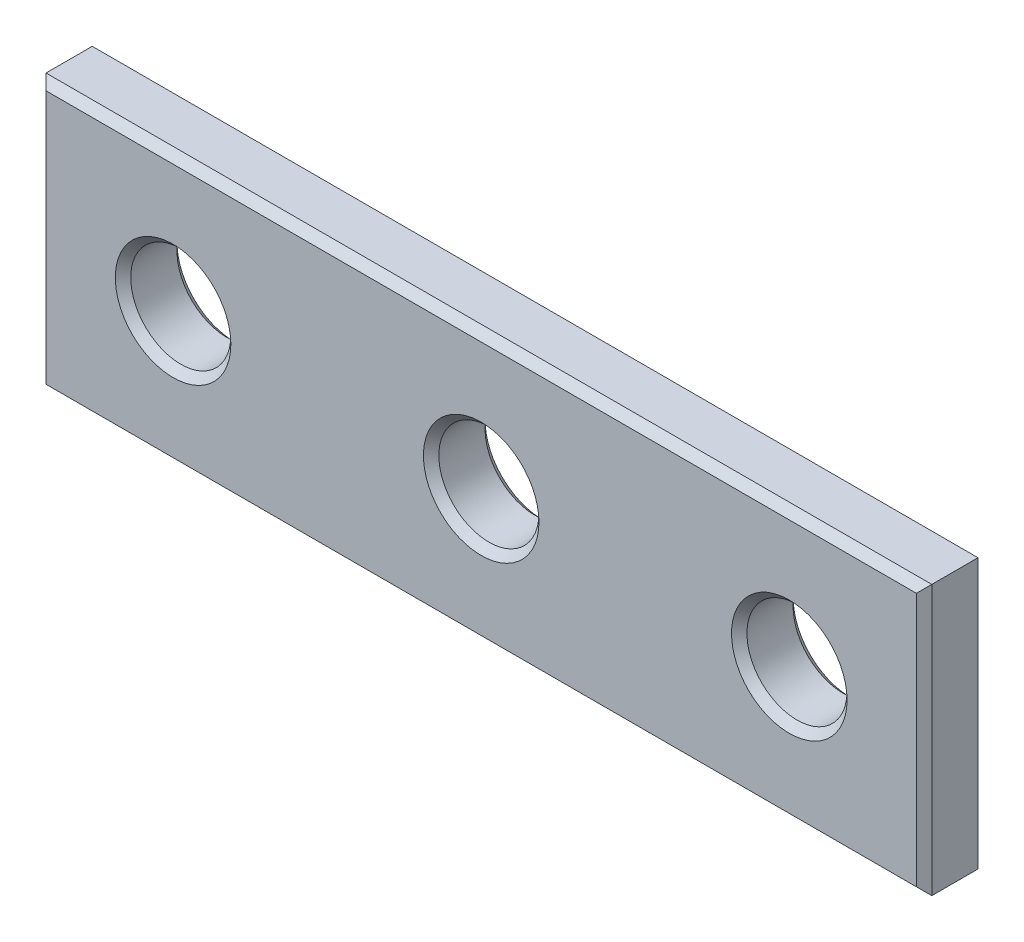
ISO-10303-21;
HEADER;
FILE_DESCRIPTION(('STEP AP214'),'2;1');
FILE_NAME('part.step','',(''),(''),'','','');
FILE_SCHEMA(('AUTOMOTIVE_DESIGN { 1 0 10303 214 1 1 1 1 }'));
ENDSEC;
DATA;
#1=APPLICATION_CONTEXT('core data for automotive mechanical design processes');
#2=APPLICATION_PROTOCOL_DEFINITION('international standard','automotive_design',2000,#1);
#3=PRODUCT_CONTEXT('',#1,'mechanical');
#4=PRODUCT('Part','Part','',(#3));
#5=PRODUCT_RELATED_PRODUCT_CATEGORY('part','',(#4));
#6=PRODUCT_DEFINITION_FORMATION('','',#4);
#7=PRODUCT_DEFINITION_CONTEXT('part definition',#1,'design');
#8=PRODUCT_DEFINITION('design','',#6,#7);
#9=PRODUCT_DEFINITION_SHAPE('','',#8);
#10=(LENGTH_UNIT() NAMED_UNIT(*) SI_UNIT(.MILLI.,.METRE.));
#11=(NAMED_UNIT(*) PLANE_ANGLE_UNIT() SI_UNIT($,.RADIAN.));
#12=(NAMED_UNIT(*) SI_UNIT($,.STERADIAN.) SOLID_ANGLE_UNIT());
#13=UNCERTAINTY_MEASURE_WITH_UNIT(LENGTH_MEASURE(1.E-05),#10,'distance_accuracy_value','');
#14=(GEOMETRIC_REPRESENTATION_CONTEXT(3) GLOBAL_UNCERTAINTY_ASSIGNED_CONTEXT((#13)) GLOBAL_UNIT_ASSIGNED_CONTEXT((#10,
#11,#12)) REPRESENTATION_CONTEXT('',''));
#15=CARTESIAN_POINT('',(0.,0.,0.));
#16=DIRECTION('',(0.,0.,1.));
#17=DIRECTION('',(1.,0.,0.));
#18=AXIS2_PLACEMENT_3D('',#15,#16,#17);
#19=CARTESIAN_POINT('',(-115.,35.,16.));
#20=DIRECTION('',(0.,0.,1.));
#21=DIRECTION('',(1.,0.,0.));
#22=AXIS2_PLACEMENT_3D('',#19,#20,#21);
#23=PLANE('',#22);
#24=CARTESIAN_POINT('',(-80.,0.,16.));
#25=DIRECTION('',(0.,0.,1.));
#26=DIRECTION('',(1.,0.,0.));
#27=AXIS2_PLACEMENT_3D('',#24,#25,#26);
#28=CIRCLE('',#27,15.);
#29=CARTESIAN_POINT('',(-65.,0.,16.));
#30=VERTEX_POINT('',#29);
#31=EDGE_CURVE('E11',#30,#30,#28,.F.);
#32=ORIENTED_EDGE('',*,*,#31,.T.);
#33=EDGE_LOOP('',(#32));
#34=FACE_BOUND('',#33,.T.);
#35=CARTESIAN_POINT('',(0.,0.,16.));
#36=DIRECTION('',(0.,0.,1.));
#37=DIRECTION('',(1.,0.,0.));
#38=AXIS2_PLACEMENT_3D('',#35,#36,#37);
#39=CIRCLE('',#38,15.);
#40=CARTESIAN_POINT('',(15.,0.,16.));
#41=VERTEX_POINT('',#40);
#42=EDGE_CURVE('E43',#41,#41,#39,.F.);
#43=ORIENTED_EDGE('',*,*,#42,.T.);
#44=EDGE_LOOP('',(#43));
#45=FACE_BOUND('',#44,.T.);
#46=DIRECTION('',(0.,1.,0.));
#47=VECTOR('',#46,1.);
#48=CARTESIAN_POINT('',(113.,35.,16.));
#49=LINE('',#48,#47);
#50=CARTESIAN_POINT('',(113.,-33.,16.));
#51=VERTEX_POINT('',#50);
#52=CARTESIAN_POINT('',(113.,33.,16.));
#53=VERTEX_POINT('',#52);
#54=EDGE_CURVE('E51',#51,#53,#49,.T.);
#55=ORIENTED_EDGE('',*,*,#54,.T.);
#56=DIRECTION('',(-1.,0.,0.));
#57=VECTOR('',#56,1.);
#58=CARTESIAN_POINT('',(-115.,33.,16.));
#59=LINE('',#58,#57);
#60=CARTESIAN_POINT('',(-113.,33.,16.));
#61=VERTEX_POINT('',#60);
#62=EDGE_CURVE('E180',#53,#61,#59,.T.);
#63=ORIENTED_EDGE('',*,*,#62,.T.);
#64=DIRECTION('',(0.,-1.,0.));
#65=VECTOR('',#64,1.);
#66=CARTESIAN_POINT('',(-113.,-35.,16.));
#67=LINE('',#66,#65);
#68=CARTESIAN_POINT('',(-113.,-33.,16.));
#69=VERTEX_POINT('',#68);
#70=EDGE_CURVE('E176',#61,#69,#67,.T.);
#71=ORIENTED_EDGE('',*,*,#70,.T.);
#72=DIRECTION('',(1.,0.,0.));
#73=VECTOR('',#72,1.);
#74=CARTESIAN_POINT('',(115.,-33.,16.));
#75=LINE('',#74,#73);
#76=EDGE_CURVE('E56',#69,#51,#75,.T.);
#77=ORIENTED_EDGE('',*,*,#76,.T.);
#78=EDGE_LOOP('',(#55,#63,#71,#77));
#79=FACE_BOUND('',#78,.T.);
#80=CARTESIAN_POINT('',(80.,0.,16.));
#81=DIRECTION('',(0.,0.,1.));
#82=DIRECTION('',(1.,0.,0.));
#83=AXIS2_PLACEMENT_3D('',#80,#81,#82);
#84=CIRCLE('',#83,15.);
#85=CARTESIAN_POINT('',(95.,0.,16.));
#86=VERTEX_POINT('',#85);
#87=EDGE_CURVE('E173',#86,#86,#84,.F.);
#88=ORIENTED_EDGE('',*,*,#87,.T.);
#89=EDGE_LOOP('',(#88));
#90=FACE_BOUND('',#89,.T.);
#91=ADVANCED_FACE('F34',(#34,#45,#79,#90),#23,.T.);
#92=CARTESIAN_POINT('',(-115.,35.,0.));
#93=DIRECTION('',(0.,0.,1.));
#94=DIRECTION('',(1.,0.,0.));
#95=AXIS2_PLACEMENT_3D('',#92,#93,#94);
#96=PLANE('',#95);
#97=CARTESIAN_POINT('',(-80.,0.,0.));
#98=DIRECTION('',(0.,0.,1.));
#99=DIRECTION('',(1.,0.,0.));
#100=AXIS2_PLACEMENT_3D('',#97,#98,#99);
#101=CIRCLE('',#100,15.);
#102=CARTESIAN_POINT('',(-65.,0.,0.));
#103=VERTEX_POINT('',#102);
#104=EDGE_CURVE('E132',#103,#103,#101,.T.);
#105=ORIENTED_EDGE('',*,*,#104,.T.);
#106=EDGE_LOOP('',(#105));
#107=FACE_BOUND('',#106,.T.);
#108=CARTESIAN_POINT('',(0.,0.,0.));
#109=DIRECTION('',(0.,0.,1.));
#110=DIRECTION('',(1.,0.,0.));
#111=AXIS2_PLACEMENT_3D('',#108,#109,#110);
#112=CIRCLE('',#111,15.);
#113=CARTESIAN_POINT('',(15.,0.,0.));
#114=VERTEX_POINT('',#113);
#115=EDGE_CURVE('E129',#114,#114,#112,.T.);
#116=ORIENTED_EDGE('',*,*,#115,.T.);
#117=EDGE_LOOP('',(#116));
#118=FACE_BOUND('',#117,.T.);
#119=DIRECTION('',(0.,-1.,0.));
#120=VECTOR('',#119,1.);
#121=CARTESIAN_POINT('',(113.,35.,0.));
#122=LINE('',#121,#120);
#123=CARTESIAN_POINT('',(113.,33.,0.));
#124=VERTEX_POINT('',#123);
#125=CARTESIAN_POINT('',(113.,-33.,0.));
#126=VERTEX_POINT('',#125);
#127=EDGE_CURVE('E128',#124,#126,#122,.T.);
#128=ORIENTED_EDGE('',*,*,#127,.T.);
#129=DIRECTION('',(-1.,0.,0.));
#130=VECTOR('',#129,1.);
#131=CARTESIAN_POINT('',(-115.,-33.,0.));
#132=LINE('',#131,#130);
#133=CARTESIAN_POINT('',(-113.,-33.,0.));
#134=VERTEX_POINT('',#133);
#135=EDGE_CURVE('E106',#126,#134,#132,.T.);
#136=ORIENTED_EDGE('',*,*,#135,.T.);
#137=DIRECTION('',(0.,1.,0.));
#138=VECTOR('',#137,1.);
#139=CARTESIAN_POINT('',(-113.,35.,0.));
#140=LINE('',#139,#138);
#141=CARTESIAN_POINT('',(-113.,33.,0.));
#142=VERTEX_POINT('',#141);
#143=EDGE_CURVE('E116',#134,#142,#140,.T.);
#144=ORIENTED_EDGE('',*,*,#143,.T.);
#145=DIRECTION('',(1.,0.,0.));
#146=VECTOR('',#145,1.);
#147=CARTESIAN_POINT('',(-115.,33.,0.));
#148=LINE('',#147,#146);
#149=EDGE_CURVE('E122',#142,#124,#148,.T.);
#150=ORIENTED_EDGE('',*,*,#149,.T.);
#151=EDGE_LOOP('',(#128,#136,#144,#150));
#152=FACE_BOUND('',#151,.T.);
#153=CARTESIAN_POINT('',(80.,0.,0.));
#154=DIRECTION('',(0.,0.,1.));
#155=DIRECTION('',(1.,0.,0.));
#156=AXIS2_PLACEMENT_3D('',#153,#154,#155);
#157=CIRCLE('',#156,15.);
#158=CARTESIAN_POINT('',(95.,0.,0.));
#159=VERTEX_POINT('',#158);
#160=EDGE_CURVE('E123',#159,#159,#157,.T.);
#161=ORIENTED_EDGE('',*,*,#160,.T.);
#162=EDGE_LOOP('',(#161));
#163=FACE_BOUND('',#162,.T.);
#164=ADVANCED_FACE('F125',(#107,#118,#152,#163),#96,.F.);
#165=CARTESIAN_POINT('',(-115.,35.,16.));
#166=DIRECTION('',(1.,0.,0.));
#167=DIRECTION('',(0.,1.,0.));
#168=AXIS2_PLACEMENT_3D('',#165,#166,#167);
#169=PLANE('',#168);
#170=DIRECTION('',(0.,0.,-1.));
#171=VECTOR('',#170,1.);
#172=CARTESIAN_POINT('',(-115.,35.,16.));
#173=LINE('',#172,#171);
#174=CARTESIAN_POINT('',(-115.,35.,14.));
#175=VERTEX_POINT('',#174);
#176=CARTESIAN_POINT('',(-115.,35.,1.99999999999999));
#177=VERTEX_POINT('',#176);
#178=EDGE_CURVE('E188',#175,#177,#173,.T.);
#179=ORIENTED_EDGE('',*,*,#178,.T.);
#180=DIRECTION('',(0.,-1.,0.));
#181=VECTOR('',#180,1.);
#182=CARTESIAN_POINT('',(-115.,35.,1.99999999999999));
#183=LINE('',#182,#181);
#184=CARTESIAN_POINT('',(-115.,-35.,1.99999999999999));
#185=VERTEX_POINT('',#184);
#186=EDGE_CURVE('E165',#177,#185,#183,.T.);
#187=ORIENTED_EDGE('',*,*,#186,.T.);
#188=DIRECTION('',(0.,0.,-1.));
#189=VECTOR('',#188,1.);
#190=CARTESIAN_POINT('',(-115.,-35.,16.));
#191=LINE('',#190,#189);
#192=CARTESIAN_POINT('',(-115.,-35.,14.));
#193=VERTEX_POINT('',#192);
#194=EDGE_CURVE('E210',#193,#185,#191,.T.);
#195=ORIENTED_EDGE('',*,*,#194,.F.);
#196=DIRECTION('',(0.,1.,0.));
#197=VECTOR('',#196,1.);
#198=CARTESIAN_POINT('',(-115.,35.,14.));
#199=LINE('',#198,#197);
#200=EDGE_CURVE('E163',#193,#175,#199,.T.);
#201=ORIENTED_EDGE('',*,*,#200,.T.);
#202=EDGE_LOOP('',(#179,#187,#195,#201));
#203=FACE_BOUND('',#202,.T.);
#204=ADVANCED_FACE('F215',(#203),#169,.F.);
#205=CARTESIAN_POINT('',(-115.,-35.,16.));
#206=DIRECTION('',(0.,1.,0.));
#207=DIRECTION('',(-1.,0.,0.));
#208=AXIS2_PLACEMENT_3D('',#205,#206,#207);
#209=PLANE('',#208);
#210=ORIENTED_EDGE('',*,*,#194,.T.);
#211=DIRECTION('',(1.,0.,0.));
#212=VECTOR('',#211,1.);
#213=CARTESIAN_POINT('',(-115.,-35.,1.99999999999999));
#214=LINE('',#213,#212);
#215=CARTESIAN_POINT('',(115.,-35.,1.99999999999999));
#216=VERTEX_POINT('',#215);
#217=EDGE_CURVE('E109',#185,#216,#214,.T.);
#218=ORIENTED_EDGE('',*,*,#217,.T.);
#219=DIRECTION('',(0.,0.,-1.));
#220=VECTOR('',#219,1.);
#221=CARTESIAN_POINT('',(115.,-35.,16.));
#222=LINE('',#221,#220);
#223=CARTESIAN_POINT('',(115.,-35.,14.));
#224=VERTEX_POINT('',#223);
#225=EDGE_CURVE('E212',#224,#216,#222,.T.);
#226=ORIENTED_EDGE('',*,*,#225,.F.);
#227=DIRECTION('',(-1.,0.,0.));
#228=VECTOR('',#227,1.);
#229=CARTESIAN_POINT('',(-115.,-35.,14.));
#230=LINE('',#229,#228);
#231=EDGE_CURVE('E151',#224,#193,#230,.T.);
#232=ORIENTED_EDGE('',*,*,#231,.T.);
#233=EDGE_LOOP('',(#210,#218,#226,#232));
#234=FACE_BOUND('',#233,.T.);
#235=ADVANCED_FACE('F209',(#234),#209,.F.);
#236=CARTESIAN_POINT('',(115.,35.,16.));
#237=DIRECTION('',(-1.,0.,0.));
#238=DIRECTION('',(0.,0.,1.));
#239=AXIS2_PLACEMENT_3D('',#236,#237,#238);
#240=PLANE('',#239);
#241=ORIENTED_EDGE('',*,*,#225,.T.);
#242=DIRECTION('',(0.,1.,0.));
#243=VECTOR('',#242,1.);
#244=CARTESIAN_POINT('',(115.,35.,1.99999999999999));
#245=LINE('',#244,#243);
#246=CARTESIAN_POINT('',(115.,35.,1.99999999999999));
#247=VERTEX_POINT('',#246);
#248=EDGE_CURVE('E156',#216,#247,#245,.T.);
#249=ORIENTED_EDGE('',*,*,#248,.T.);
#250=DIRECTION('',(0.,0.,-1.));
#251=VECTOR('',#250,1.);
#252=CARTESIAN_POINT('',(115.,35.,16.));
#253=LINE('',#252,#251);
#254=CARTESIAN_POINT('',(115.,35.,14.));
#255=VERTEX_POINT('',#254);
#256=EDGE_CURVE('E220',#255,#247,#253,.T.);
#257=ORIENTED_EDGE('',*,*,#256,.F.);
#258=DIRECTION('',(0.,-1.,0.));
#259=VECTOR('',#258,1.);
#260=CARTESIAN_POINT('',(115.,-35.,14.));
#261=LINE('',#260,#259);
#262=EDGE_CURVE('E154',#255,#224,#261,.T.);
#263=ORIENTED_EDGE('',*,*,#262,.T.);
#264=EDGE_LOOP('',(#241,#249,#257,#263));
#265=FACE_BOUND('',#264,.T.);
#266=ADVANCED_FACE('F233',(#265),#240,.F.);
#267=CARTESIAN_POINT('',(-115.,35.,16.));
#268=DIRECTION('',(0.,-1.,0.));
#269=DIRECTION('',(0.,0.,-1.));
#270=AXIS2_PLACEMENT_3D('',#267,#268,#269);
#271=PLANE('',#270);
#272=ORIENTED_EDGE('',*,*,#256,.T.);
#273=DIRECTION('',(-1.,0.,0.));
#274=VECTOR('',#273,1.);
#275=CARTESIAN_POINT('',(-115.,35.,1.99999999999999));
#276=LINE('',#275,#274);
#277=EDGE_CURVE('E161',#247,#177,#276,.T.);
#278=ORIENTED_EDGE('',*,*,#277,.T.);
#279=ORIENTED_EDGE('',*,*,#178,.F.);
#280=DIRECTION('',(1.,0.,0.));
#281=VECTOR('',#280,1.);
#282=CARTESIAN_POINT('',(115.,35.,14.));
#283=LINE('',#282,#281);
#284=EDGE_CURVE('E158',#175,#255,#283,.T.);
#285=ORIENTED_EDGE('',*,*,#284,.T.);
#286=EDGE_LOOP('',(#272,#278,#279,#285));
#287=FACE_BOUND('',#286,.T.);
#288=ADVANCED_FACE('F237',(#287),#271,.F.);
#289=CARTESIAN_POINT('',(0.,0.,16.));
#290=DIRECTION('',(0.,0.,-1.));
#291=DIRECTION('',(-1.,0.,0.));
#292=AXIS2_PLACEMENT_3D('',#289,#290,#291);
#293=CYLINDRICAL_SURFACE('',#292,13.);
#294=CARTESIAN_POINT('',(0.,0.,2.00000000000001));
#295=DIRECTION('',(0.,0.,1.));
#296=DIRECTION('',(1.,0.,0.));
#297=AXIS2_PLACEMENT_3D('',#294,#295,#296);
#298=CIRCLE('',#297,13.);
#299=CARTESIAN_POINT('',(13.,0.,2.00000000000001));
#300=VERTEX_POINT('',#299);
#301=EDGE_CURVE('E148',#300,#300,#298,.F.);
#302=ORIENTED_EDGE('',*,*,#301,.T.);
#303=EDGE_LOOP('',(#302));
#304=FACE_BOUND('',#303,.T.);
#305=CARTESIAN_POINT('',(0.,0.,14.));
#306=DIRECTION('',(0.,0.,1.));
#307=DIRECTION('',(1.,0.,0.));
#308=AXIS2_PLACEMENT_3D('',#305,#306,#307);
#309=CIRCLE('',#308,13.);
#310=CARTESIAN_POINT('',(13.,0.,14.));
#311=VERTEX_POINT('',#310);
#312=EDGE_CURVE('E145',#311,#311,#309,.T.);
#313=ORIENTED_EDGE('',*,*,#312,.T.);
#314=EDGE_LOOP('',(#313));
#315=FACE_BOUND('',#314,.T.);
#316=ADVANCED_FACE('F256',(#304,#315),#293,.F.);
#317=CARTESIAN_POINT('',(80.,0.,16.));
#318=DIRECTION('',(0.,0.,-1.));
#319=DIRECTION('',(-1.,0.,0.));
#320=AXIS2_PLACEMENT_3D('',#317,#318,#319);
#321=CYLINDRICAL_SURFACE('',#320,13.);
#322=CARTESIAN_POINT('',(80.,0.,2.00000000000001));
#323=DIRECTION('',(0.,0.,1.));
#324=DIRECTION('',(1.,0.,0.));
#325=AXIS2_PLACEMENT_3D('',#322,#323,#324);
#326=CIRCLE('',#325,13.);
#327=CARTESIAN_POINT('',(93.,0.,2.00000000000001));
#328=VERTEX_POINT('',#327);
#329=EDGE_CURVE('E170',#328,#328,#326,.F.);
#330=ORIENTED_EDGE('',*,*,#329,.T.);
#331=EDGE_LOOP('',(#330));
#332=FACE_BOUND('',#331,.T.);
#333=CARTESIAN_POINT('',(80.,0.,14.));
#334=DIRECTION('',(0.,0.,1.));
#335=DIRECTION('',(1.,0.,0.));
#336=AXIS2_PLACEMENT_3D('',#333,#334,#335);
#337=CIRCLE('',#336,13.);
#338=CARTESIAN_POINT('',(93.,0.,14.));
#339=VERTEX_POINT('',#338);
#340=EDGE_CURVE('E167',#339,#339,#337,.T.);
#341=ORIENTED_EDGE('',*,*,#340,.T.);
#342=EDGE_LOOP('',(#341));
#343=FACE_BOUND('',#342,.T.);
#344=ADVANCED_FACE('F253',(#332,#343),#321,.F.);
#345=CARTESIAN_POINT('',(-80.,0.,16.));
#346=DIRECTION('',(0.,0.,-1.));
#347=DIRECTION('',(-1.,0.,0.));
#348=AXIS2_PLACEMENT_3D('',#345,#346,#347);
#349=CYLINDRICAL_SURFACE('',#348,13.);
#350=CARTESIAN_POINT('',(-80.,0.,2.00000000000001));
#351=DIRECTION('',(0.,0.,1.));
#352=DIRECTION('',(1.,0.,0.));
#353=AXIS2_PLACEMENT_3D('',#350,#351,#352);
#354=CIRCLE('',#353,13.);
#355=CARTESIAN_POINT('',(-67.,0.,2.00000000000001));
#356=VERTEX_POINT('',#355);
#357=EDGE_CURVE('E142',#356,#356,#354,.F.);
#358=ORIENTED_EDGE('',*,*,#357,.T.);
#359=EDGE_LOOP('',(#358));
#360=FACE_BOUND('',#359,.T.);
#361=CARTESIAN_POINT('',(-80.,0.,14.));
#362=DIRECTION('',(0.,0.,1.));
#363=DIRECTION('',(1.,0.,0.));
#364=AXIS2_PLACEMENT_3D('',#361,#362,#363);
#365=CIRCLE('',#364,13.);
#366=CARTESIAN_POINT('',(-67.,0.,14.));
#367=VERTEX_POINT('',#366);
#368=EDGE_CURVE('E139',#367,#367,#365,.T.);
#369=ORIENTED_EDGE('',*,*,#368,.T.);
#370=EDGE_LOOP('',(#369));
#371=FACE_BOUND('',#370,.T.);
#372=ADVANCED_FACE('F255',(#360,#371),#349,.F.);
#373=CARTESIAN_POINT('',(-80.,0.,0.));
#374=DIRECTION('',(0.,0.,-1.));
#375=DIRECTION('',(-1.,0.,0.));
#376=AXIS2_PLACEMENT_3D('',#373,#374,#375);
#377=CONICAL_SURFACE('',#376,15.,0.785398163397442);
#378=ORIENTED_EDGE('',*,*,#357,.F.);
#379=EDGE_LOOP('',(#378));
#380=FACE_BOUND('',#379,.T.);
#381=ORIENTED_EDGE('',*,*,#104,.F.);
#382=EDGE_LOOP('',(#381));
#383=FACE_BOUND('',#382,.T.);
#384=ADVANCED_FACE('F263',(#380,#383),#377,.F.);
#385=CARTESIAN_POINT('',(0.,0.,0.));
#386=DIRECTION('',(0.,0.,-1.));
#387=DIRECTION('',(-1.,0.,0.));
#388=AXIS2_PLACEMENT_3D('',#385,#386,#387);
#389=CONICAL_SURFACE('',#388,15.,0.785398163397447);
#390=ORIENTED_EDGE('',*,*,#301,.F.);
#391=EDGE_LOOP('',(#390));
#392=FACE_BOUND('',#391,.T.);
#393=ORIENTED_EDGE('',*,*,#115,.F.);
#394=EDGE_LOOP('',(#393));
#395=FACE_BOUND('',#394,.T.);
#396=ADVANCED_FACE('F282',(#392,#395),#389,.F.);
#397=CARTESIAN_POINT('',(-115.,35.,1.99999999999999));
#398=DIRECTION('',(0.,-0.707106781186544,0.707106781186551));
#399=DIRECTION('',(0.,-0.707106781186551,-0.707106781186544));
#400=AXIS2_PLACEMENT_3D('',#397,#398,#399);
#401=PLANE('',#400);
#402=DIRECTION('',(-0.57735026918963,-0.577350269189626,-0.57735026918962));
#403=VECTOR('',#402,1.);
#404=CARTESIAN_POINT('',(38.3333333333321,-41.6666666666674,-74.6666666666666));
#405=LINE('',#404,#403);
#406=EDGE_CURVE('E112',#124,#247,#405,.F.);
#407=ORIENTED_EDGE('',*,*,#406,.F.);
#408=ORIENTED_EDGE('',*,*,#149,.F.);
#409=DIRECTION('',(0.577350269189631,-0.577350269189626,-0.57735026918962));
#410=VECTOR('',#409,1.);
#411=CARTESIAN_POINT('',(-115.,35.,1.99999999999999));
#412=LINE('',#411,#410);
#413=EDGE_CURVE('E119',#177,#142,#412,.T.);
#414=ORIENTED_EDGE('',*,*,#413,.F.);
#415=ORIENTED_EDGE('',*,*,#277,.F.);
#416=EDGE_LOOP('',(#407,#408,#414,#415));
#417=FACE_BOUND('',#416,.T.);
#418=ADVANCED_FACE('F226',(#417),#401,.F.);
#419=CARTESIAN_POINT('',(-115.,35.,1.99999999999999));
#420=DIRECTION('',(0.707106781186541,0.,0.707106781186554));
#421=DIRECTION('',(0.707106781186554,0.,-0.707106781186541));
#422=AXIS2_PLACEMENT_3D('',#419,#420,#421);
#423=PLANE('',#422);
#424=ORIENTED_EDGE('',*,*,#413,.T.);
#425=ORIENTED_EDGE('',*,*,#143,.F.);
#426=DIRECTION('',(-0.577350269189631,-0.577350269189625,0.577350269189621));
#427=VECTOR('',#426,1.);
#428=CARTESIAN_POINT('',(-91.6666666666665,-11.6666666666667,-21.3333333333331));
#429=LINE('',#428,#427);
#430=EDGE_CURVE('E102',#185,#134,#429,.F.);
#431=ORIENTED_EDGE('',*,*,#430,.F.);
#432=ORIENTED_EDGE('',*,*,#186,.F.);
#433=EDGE_LOOP('',(#424,#425,#431,#432));
#434=FACE_BOUND('',#433,.T.);
#435=ADVANCED_FACE('F117',(#434),#423,.F.);
#436=CARTESIAN_POINT('',(115.,35.,1.99999999999999));
#437=DIRECTION('',(-0.707106781186541,0.,0.707106781186554));
#438=DIRECTION('',(0.707106781186554,0.,0.707106781186541));
#439=AXIS2_PLACEMENT_3D('',#436,#437,#438);
#440=PLANE('',#439);
#441=ORIENTED_EDGE('',*,*,#406,.T.);
#442=ORIENTED_EDGE('',*,*,#248,.F.);
#443=DIRECTION('',(-0.577350269189631,0.577350269189625,-0.577350269189621));
#444=VECTOR('',#443,1.);
#445=CARTESIAN_POINT('',(91.6666666666665,-11.6666666666668,-21.3333333333331));
#446=LINE('',#445,#444);
#447=EDGE_CURVE('E113',#126,#216,#446,.F.);
#448=ORIENTED_EDGE('',*,*,#447,.F.);
#449=ORIENTED_EDGE('',*,*,#127,.F.);
#450=EDGE_LOOP('',(#441,#442,#448,#449));
#451=FACE_BOUND('',#450,.T.);
#452=ADVANCED_FACE('F229',(#451),#440,.F.);
#453=CARTESIAN_POINT('',(-115.,-35.,1.99999999999999));
#454=DIRECTION('',(0.,0.707106781186545,0.70710678118655));
#455=DIRECTION('',(0.,-0.70710678118655,0.707106781186545));
#456=AXIS2_PLACEMENT_3D('',#453,#454,#455);
#457=PLANE('',#456);
#458=ORIENTED_EDGE('',*,*,#430,.T.);
#459=ORIENTED_EDGE('',*,*,#135,.F.);
#460=ORIENTED_EDGE('',*,*,#447,.T.);
#461=ORIENTED_EDGE('',*,*,#217,.F.);
#462=EDGE_LOOP('',(#458,#459,#460,#461));
#463=FACE_BOUND('',#462,.T.);
#464=ADVANCED_FACE('F104',(#463),#457,.F.);
#465=CARTESIAN_POINT('',(80.,0.,0.));
#466=DIRECTION('',(0.,0.,-1.));
#467=DIRECTION('',(-1.,0.,0.));
#468=AXIS2_PLACEMENT_3D('',#465,#466,#467);
#469=CONICAL_SURFACE('',#468,15.,0.785398163397442);
#470=ORIENTED_EDGE('',*,*,#329,.F.);
#471=EDGE_LOOP('',(#470));
#472=FACE_BOUND('',#471,.T.);
#473=ORIENTED_EDGE('',*,*,#160,.F.);
#474=EDGE_LOOP('',(#473));
#475=FACE_BOUND('',#474,.T.);
#476=ADVANCED_FACE('F289',(#472,#475),#469,.F.);
#477=CARTESIAN_POINT('',(-80.,0.,14.));
#478=DIRECTION('',(0.,0.,1.));
#479=DIRECTION('',(1.,0.,0.));
#480=AXIS2_PLACEMENT_3D('',#477,#478,#479);
#481=CONICAL_SURFACE('',#480,13.,0.785398163397453);
#482=ORIENTED_EDGE('',*,*,#31,.F.);
#483=EDGE_LOOP('',(#482));
#484=FACE_BOUND('',#483,.T.);
#485=ORIENTED_EDGE('',*,*,#368,.F.);
#486=EDGE_LOOP('',(#485));
#487=FACE_BOUND('',#486,.T.);
#488=ADVANCED_FACE('F298',(#484,#487),#481,.F.);
#489=CARTESIAN_POINT('',(0.,0.,14.));
#490=DIRECTION('',(0.,0.,1.));
#491=DIRECTION('',(1.,0.,0.));
#492=AXIS2_PLACEMENT_3D('',#489,#490,#491);
#493=CONICAL_SURFACE('',#492,13.,0.78539816339745);
#494=ORIENTED_EDGE('',*,*,#42,.F.);
#495=EDGE_LOOP('',(#494));
#496=FACE_BOUND('',#495,.T.);
#497=ORIENTED_EDGE('',*,*,#312,.F.);
#498=EDGE_LOOP('',(#497));
#499=FACE_BOUND('',#498,.T.);
#500=ADVANCED_FACE('F302',(#496,#499),#493,.F.);
#501=CARTESIAN_POINT('',(-115.,-33.,16.));
#502=DIRECTION('',(0.,-0.707106781186552,0.707106781186543));
#503=DIRECTION('',(0.,-0.707106781186543,-0.707106781186552));
#504=AXIS2_PLACEMENT_3D('',#501,#502,#503);
#505=PLANE('',#504);
#506=DIRECTION('',(0.577350269189627,0.577350269189621,0.577350269189629));
#507=VECTOR('',#506,1.);
#508=CARTESIAN_POINT('',(-90.3333333333334,-10.3333333333337,38.6666666666666));
#509=LINE('',#508,#507);
#510=EDGE_CURVE('E192',#193,#69,#509,.T.);
#511=ORIENTED_EDGE('',*,*,#510,.F.);
#512=ORIENTED_EDGE('',*,*,#231,.F.);
#513=DIRECTION('',(-0.577350269189622,0.577350269189624,0.577350269189631));
#514=VECTOR('',#513,1.);
#515=CARTESIAN_POINT('',(37.000000000001,42.9999999999992,92.0000000000002));
#516=LINE('',#515,#514);
#517=EDGE_CURVE('E38',#51,#224,#516,.F.);
#518=ORIENTED_EDGE('',*,*,#517,.F.);
#519=ORIENTED_EDGE('',*,*,#76,.F.);
#520=EDGE_LOOP('',(#511,#512,#518,#519));
#521=FACE_BOUND('',#520,.T.);
#522=ADVANCED_FACE('F204',(#521),#505,.T.);
#523=CARTESIAN_POINT('',(113.,35.,16.));
#524=DIRECTION('',(0.707106781186553,0.,0.707106781186542));
#525=DIRECTION('',(0.707106781186542,0.,-0.707106781186553));
#526=AXIS2_PLACEMENT_3D('',#523,#524,#525);
#527=PLANE('',#526);
#528=ORIENTED_EDGE('',*,*,#517,.T.);
#529=ORIENTED_EDGE('',*,*,#262,.F.);
#530=DIRECTION('',(-0.577350269189621,-0.577350269189625,0.577350269189631));
#531=VECTOR('',#530,1.);
#532=CARTESIAN_POINT('',(113.666666666667,33.6666666666667,15.3333333333333));
#533=LINE('',#532,#531);
#534=EDGE_CURVE('E191',#53,#255,#533,.F.);
#535=ORIENTED_EDGE('',*,*,#534,.F.);
#536=ORIENTED_EDGE('',*,*,#54,.F.);
#537=EDGE_LOOP('',(#528,#529,#535,#536));
#538=FACE_BOUND('',#537,.T.);
#539=ADVANCED_FACE('F201',(#538),#527,.T.);
#540=CARTESIAN_POINT('',(-113.,35.,16.));
#541=DIRECTION('',(-0.707106781186549,0.,0.707106781186547));
#542=DIRECTION('',(0.707106781186547,0.,0.707106781186549));
#543=AXIS2_PLACEMENT_3D('',#540,#541,#542);
#544=PLANE('',#543);
#545=ORIENTED_EDGE('',*,*,#510,.T.);
#546=ORIENTED_EDGE('',*,*,#70,.F.);
#547=DIRECTION('',(-0.577350269189627,0.577350269189623,-0.577350269189628));
#548=VECTOR('',#547,1.);
#549=CARTESIAN_POINT('',(-113.666666666667,33.6666666666666,15.3333333333333));
#550=LINE('',#549,#548);
#551=EDGE_CURVE('E189',#175,#61,#550,.F.);
#552=ORIENTED_EDGE('',*,*,#551,.F.);
#553=ORIENTED_EDGE('',*,*,#200,.F.);
#554=EDGE_LOOP('',(#545,#546,#552,#553));
#555=FACE_BOUND('',#554,.T.);
#556=ADVANCED_FACE('F242',(#555),#544,.T.);
#557=CARTESIAN_POINT('',(-115.,33.,16.));
#558=DIRECTION('',(0.,0.707106781186551,0.707106781186544));
#559=DIRECTION('',(0.,-0.707106781186544,0.707106781186551));
#560=AXIS2_PLACEMENT_3D('',#557,#558,#559);
#561=PLANE('',#560);
#562=ORIENTED_EDGE('',*,*,#534,.T.);
#563=ORIENTED_EDGE('',*,*,#284,.F.);
#564=ORIENTED_EDGE('',*,*,#551,.T.);
#565=ORIENTED_EDGE('',*,*,#62,.F.);
#566=EDGE_LOOP('',(#562,#563,#564,#565));
#567=FACE_BOUND('',#566,.T.);
#568=ADVANCED_FACE('F240',(#567),#561,.T.);
#569=CARTESIAN_POINT('',(80.,0.,14.));
#570=DIRECTION('',(0.,0.,1.));
#571=DIRECTION('',(1.,0.,0.));
#572=AXIS2_PLACEMENT_3D('',#569,#570,#571);
#573=CONICAL_SURFACE('',#572,13.,0.785398163397453);
#574=ORIENTED_EDGE('',*,*,#87,.F.);
#575=EDGE_LOOP('',(#574));
#576=FACE_BOUND('',#575,.T.);
#577=ORIENTED_EDGE('',*,*,#340,.F.);
#578=EDGE_LOOP('',(#577));
#579=FACE_BOUND('',#578,.T.);
#580=ADVANCED_FACE('F36',(#576,#579),#573,.F.);
#581=CLOSED_SHELL('',(#91,#164,#204,#235,#266,#288,#316,#344,#372,#384,#396,#418,#435,#452,#464,
#476,#488,#500,#522,#539,#556,#568,#580));
#582=MANIFOLD_SOLID_BREP('B2',#581);
#583=ADVANCED_BREP_SHAPE_REPRESENTATION('',(#18,#582),#14);
#584=SHAPE_DEFINITION_REPRESENTATION(#9,#583);
ENDSEC;
END-ISO-10303-21;
